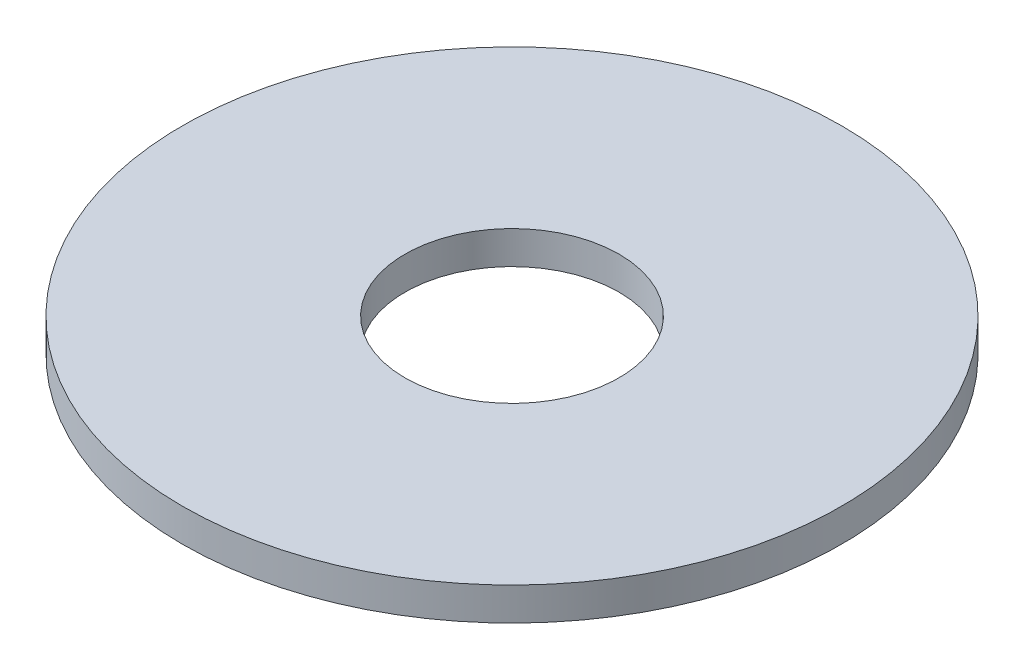
ISO-10303-21;
HEADER;
FILE_DESCRIPTION(('STEP AP214'),'2;1');
FILE_NAME('part.step','',(''),(''),'','','');
FILE_SCHEMA(('AUTOMOTIVE_DESIGN { 1 0 10303 214 1 1 1 1 }'));
ENDSEC;
DATA;
#1=APPLICATION_CONTEXT('core data for automotive mechanical design processes');
#2=APPLICATION_PROTOCOL_DEFINITION('international standard','automotive_design',2000,#1);
#3=PRODUCT_CONTEXT('',#1,'mechanical');
#4=PRODUCT('Part','Part','',(#3));
#5=PRODUCT_RELATED_PRODUCT_CATEGORY('part','',(#4));
#6=PRODUCT_DEFINITION_FORMATION('','',#4);
#7=PRODUCT_DEFINITION_CONTEXT('part definition',#1,'design');
#8=PRODUCT_DEFINITION('design','',#6,#7);
#9=PRODUCT_DEFINITION_SHAPE('','',#8);
#10=(LENGTH_UNIT() NAMED_UNIT(*) SI_UNIT(.MILLI.,.METRE.));
#11=(NAMED_UNIT(*) PLANE_ANGLE_UNIT() SI_UNIT($,.RADIAN.));
#12=(NAMED_UNIT(*) SI_UNIT($,.STERADIAN.) SOLID_ANGLE_UNIT());
#13=UNCERTAINTY_MEASURE_WITH_UNIT(LENGTH_MEASURE(1.E-05),#10,'distance_accuracy_value','');
#14=(GEOMETRIC_REPRESENTATION_CONTEXT(3) GLOBAL_UNCERTAINTY_ASSIGNED_CONTEXT((#13)) GLOBAL_UNIT_ASSIGNED_CONTEXT((#10,
#11,#12)) REPRESENTATION_CONTEXT('',''));
#15=CARTESIAN_POINT('',(0.,0.,0.));
#16=DIRECTION('',(0.,0.,1.));
#17=DIRECTION('',(1.,0.,0.));
#18=AXIS2_PLACEMENT_3D('',#15,#16,#17);
#19=CARTESIAN_POINT('',(0.,1.,0.));
#20=DIRECTION('',(0.,1.,0.));
#21=DIRECTION('',(0.,0.,1.));
#22=AXIS2_PLACEMENT_3D('',#19,#20,#21);
#23=PLANE('',#22);
#24=CARTESIAN_POINT('',(0.,1.,0.));
#25=DIRECTION('',(0.,1.,0.));
#26=DIRECTION('',(0.,0.,1.));
#27=AXIS2_PLACEMENT_3D('',#24,#25,#26);
#28=CIRCLE('',#27,10.);
#29=CARTESIAN_POINT('',(0.,1.,10.));
#30=VERTEX_POINT('',#29);
#31=EDGE_CURVE('E10',#30,#30,#28,.T.);
#32=ORIENTED_EDGE('',*,*,#31,.T.);
#33=EDGE_LOOP('',(#32));
#34=FACE_BOUND('',#33,.T.);
#35=CARTESIAN_POINT('',(0.,1.,0.));
#36=DIRECTION('',(0.,1.,0.));
#37=DIRECTION('',(0.,0.,1.));
#38=AXIS2_PLACEMENT_3D('',#35,#36,#37);
#39=CIRCLE('',#38,3.25);
#40=CARTESIAN_POINT('',(0.,1.,3.25));
#41=VERTEX_POINT('',#40);
#42=EDGE_CURVE('E44',#41,#41,#39,.T.);
#43=ORIENTED_EDGE('',*,*,#42,.F.);
#44=EDGE_LOOP('',(#43));
#45=FACE_BOUND('',#44,.T.);
#46=ADVANCED_FACE('F33',(#34,#45),#23,.T.);
#47=CARTESIAN_POINT('',(0.,0.,0.));
#48=DIRECTION('',(0.,1.,0.));
#49=DIRECTION('',(0.,0.,1.));
#50=AXIS2_PLACEMENT_3D('',#47,#48,#49);
#51=PLANE('',#50);
#52=CARTESIAN_POINT('',(0.,0.,0.));
#53=DIRECTION('',(0.,1.,0.));
#54=DIRECTION('',(0.,0.,1.));
#55=AXIS2_PLACEMENT_3D('',#52,#53,#54);
#56=CIRCLE('',#55,10.);
#57=CARTESIAN_POINT('',(0.,0.,10.));
#58=VERTEX_POINT('',#57);
#59=EDGE_CURVE('E37',#58,#58,#56,.T.);
#60=ORIENTED_EDGE('',*,*,#59,.F.);
#61=EDGE_LOOP('',(#60));
#62=FACE_BOUND('',#61,.T.);
#63=CARTESIAN_POINT('',(0.,0.,0.));
#64=DIRECTION('',(0.,1.,0.));
#65=DIRECTION('',(0.,0.,1.));
#66=AXIS2_PLACEMENT_3D('',#63,#64,#65);
#67=CIRCLE('',#66,3.25);
#68=CARTESIAN_POINT('',(0.,0.,3.25));
#69=VERTEX_POINT('',#68);
#70=EDGE_CURVE('E46',#69,#69,#67,.T.);
#71=ORIENTED_EDGE('',*,*,#70,.T.);
#72=EDGE_LOOP('',(#71));
#73=FACE_BOUND('',#72,.T.);
#74=ADVANCED_FACE('F56',(#62,#73),#51,.F.);
#75=CARTESIAN_POINT('',(0.,1.,0.));
#76=DIRECTION('',(0.,-1.,0.));
#77=DIRECTION('',(0.,0.,-1.));
#78=AXIS2_PLACEMENT_3D('',#75,#76,#77);
#79=CYLINDRICAL_SURFACE('',#78,10.);
#80=ORIENTED_EDGE('',*,*,#31,.F.);
#81=EDGE_LOOP('',(#80));
#82=FACE_BOUND('',#81,.T.);
#83=ORIENTED_EDGE('',*,*,#59,.T.);
#84=EDGE_LOOP('',(#83));
#85=FACE_BOUND('',#84,.T.);
#86=ADVANCED_FACE('F35',(#82,#85),#79,.T.);
#87=CARTESIAN_POINT('',(0.,1.,0.));
#88=DIRECTION('',(0.,-1.,0.));
#89=DIRECTION('',(0.,0.,-1.));
#90=AXIS2_PLACEMENT_3D('',#87,#88,#89);
#91=CYLINDRICAL_SURFACE('',#90,3.25);
#92=ORIENTED_EDGE('',*,*,#42,.T.);
#93=EDGE_LOOP('',(#92));
#94=FACE_BOUND('',#93,.T.);
#95=ORIENTED_EDGE('',*,*,#70,.F.);
#96=EDGE_LOOP('',(#95));
#97=FACE_BOUND('',#96,.T.);
#98=ADVANCED_FACE('F52',(#94,#97),#91,.F.);
#99=CLOSED_SHELL('',(#46,#74,#86,#98));
#100=MANIFOLD_SOLID_BREP('B2',#99);
#101=ADVANCED_BREP_SHAPE_REPRESENTATION('',(#18,#100),#14);
#102=SHAPE_DEFINITION_REPRESENTATION(#9,#101);
ENDSEC;
END-ISO-10303-21;
